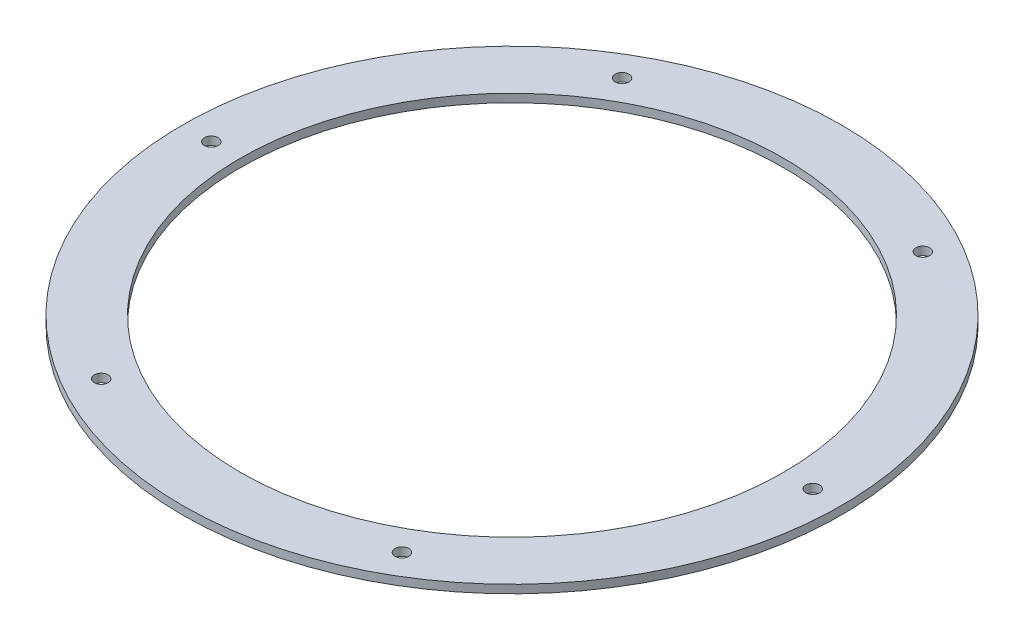
ISO-10303-21;
HEADER;
FILE_DESCRIPTION(('STEP AP214'),'2;1');
FILE_NAME('part.step','',(''),(''),'','','');
FILE_SCHEMA(('AUTOMOTIVE_DESIGN { 1 0 10303 214 1 1 1 1 }'));
ENDSEC;
DATA;
#1=APPLICATION_CONTEXT('core data for automotive mechanical design processes');
#2=APPLICATION_PROTOCOL_DEFINITION('international standard','automotive_design',2000,#1);
#3=PRODUCT_CONTEXT('',#1,'mechanical');
#4=PRODUCT('Part','Part','',(#3));
#5=PRODUCT_RELATED_PRODUCT_CATEGORY('part','',(#4));
#6=PRODUCT_DEFINITION_FORMATION('','',#4);
#7=PRODUCT_DEFINITION_CONTEXT('part definition',#1,'design');
#8=PRODUCT_DEFINITION('design','',#6,#7);
#9=PRODUCT_DEFINITION_SHAPE('','',#8);
#10=(LENGTH_UNIT() NAMED_UNIT(*) SI_UNIT(.MILLI.,.METRE.));
#11=(NAMED_UNIT(*) PLANE_ANGLE_UNIT() SI_UNIT($,.RADIAN.));
#12=(NAMED_UNIT(*) SI_UNIT($,.STERADIAN.) SOLID_ANGLE_UNIT());
#13=UNCERTAINTY_MEASURE_WITH_UNIT(LENGTH_MEASURE(1.E-05),#10,'distance_accuracy_value','');
#14=(GEOMETRIC_REPRESENTATION_CONTEXT(3) GLOBAL_UNCERTAINTY_ASSIGNED_CONTEXT((#13)) GLOBAL_UNIT_ASSIGNED_CONTEXT((#10,
#11,#12)) REPRESENTATION_CONTEXT('',''));
#15=CARTESIAN_POINT('',(0.,0.,0.));
#16=DIRECTION('',(0.,0.,1.));
#17=DIRECTION('',(1.,0.,0.));
#18=AXIS2_PLACEMENT_3D('',#15,#16,#17);
#19=CARTESIAN_POINT('',(0.,3.,0.));
#20=DIRECTION('',(0.,1.,0.));
#21=DIRECTION('',(0.,0.,1.));
#22=AXIS2_PLACEMENT_3D('',#19,#20,#21);
#23=PLANE('',#22);
#24=CARTESIAN_POINT('',(54.7499999999991,3.,94.8297817143965));
#25=DIRECTION('',(0.,1.,0.));
#26=DIRECTION('',(0.,0.,1.));
#27=AXIS2_PLACEMENT_3D('',#24,#25,#26);
#28=CIRCLE('',#27,2.49999999999999);
#29=CARTESIAN_POINT('',(54.7499999999991,3.,97.3297817143965));
#30=VERTEX_POINT('',#29);
#31=EDGE_CURVE('E71',#30,#30,#28,.T.);
#32=ORIENTED_EDGE('',*,*,#31,.F.);
#33=EDGE_LOOP('',(#32));
#34=FACE_BOUND('',#33,.T.);
#35=CARTESIAN_POINT('',(54.7500000000004,3.,-94.8297817143958));
#36=DIRECTION('',(0.,1.,0.));
#37=DIRECTION('',(0.,0.,1.));
#38=AXIS2_PLACEMENT_3D('',#35,#36,#37);
#39=CIRCLE('',#38,2.5);
#40=CARTESIAN_POINT('',(54.7500000000004,3.,-92.3297817143958));
#41=VERTEX_POINT('',#40);
#42=EDGE_CURVE('E59',#41,#41,#39,.T.);
#43=ORIENTED_EDGE('',*,*,#42,.F.);
#44=EDGE_LOOP('',(#43));
#45=FACE_BOUND('',#44,.T.);
#46=CARTESIAN_POINT('',(-109.5,3.,0.));
#47=DIRECTION('',(0.,1.,0.));
#48=DIRECTION('',(0.,0.,1.));
#49=AXIS2_PLACEMENT_3D('',#46,#47,#48);
#50=CIRCLE('',#49,2.5);
#51=CARTESIAN_POINT('',(-109.5,3.,2.5));
#52=VERTEX_POINT('',#51);
#53=EDGE_CURVE('E47',#52,#52,#50,.T.);
#54=ORIENTED_EDGE('',*,*,#53,.F.);
#55=EDGE_LOOP('',(#54));
#56=FACE_BOUND('',#55,.T.);
#57=CARTESIAN_POINT('',(0.,3.,0.));
#58=DIRECTION('',(0.,1.,0.));
#59=DIRECTION('',(0.,0.,1.));
#60=AXIS2_PLACEMENT_3D('',#57,#58,#59);
#61=CIRCLE('',#60,120.);
#62=CARTESIAN_POINT('',(0.,3.,120.));
#63=VERTEX_POINT('',#62);
#64=EDGE_CURVE('E10',#63,#63,#61,.T.);
#65=ORIENTED_EDGE('',*,*,#64,.T.);
#66=EDGE_LOOP('',(#65));
#67=FACE_BOUND('',#66,.T.);
#68=CARTESIAN_POINT('',(0.,3.,0.));
#69=DIRECTION('',(0.,1.,0.));
#70=DIRECTION('',(0.,0.,1.));
#71=AXIS2_PLACEMENT_3D('',#68,#69,#70);
#72=CIRCLE('',#71,99.);
#73=CARTESIAN_POINT('',(0.,3.,99.));
#74=VERTEX_POINT('',#73);
#75=EDGE_CURVE('E42',#74,#74,#72,.T.);
#76=ORIENTED_EDGE('',*,*,#75,.F.);
#77=EDGE_LOOP('',(#76));
#78=FACE_BOUND('',#77,.T.);
#79=CARTESIAN_POINT('',(-54.7499999999998,3.,-94.8297817143961));
#80=DIRECTION('',(0.,1.,0.));
#81=DIRECTION('',(0.,0.,1.));
#82=AXIS2_PLACEMENT_3D('',#79,#80,#81);
#83=CIRCLE('',#82,2.49999999999999);
#84=CARTESIAN_POINT('',(-54.7499999999998,3.,-92.3297817143962));
#85=VERTEX_POINT('',#84);
#86=EDGE_CURVE('E53',#85,#85,#83,.T.);
#87=ORIENTED_EDGE('',*,*,#86,.F.);
#88=EDGE_LOOP('',(#87));
#89=FACE_BOUND('',#88,.T.);
#90=CARTESIAN_POINT('',(109.5,3.,7.64634413206646E-13));
#91=DIRECTION('',(0.,1.,0.));
#92=DIRECTION('',(0.,0.,1.));
#93=AXIS2_PLACEMENT_3D('',#90,#91,#92);
#94=CIRCLE('',#93,2.49999999999999);
#95=CARTESIAN_POINT('',(109.5,3.,2.50000000000075));
#96=VERTEX_POINT('',#95);
#97=EDGE_CURVE('E65',#96,#96,#94,.T.);
#98=ORIENTED_EDGE('',*,*,#97,.F.);
#99=EDGE_LOOP('',(#98));
#100=FACE_BOUND('',#99,.T.);
#101=CARTESIAN_POINT('',(-54.7500000000011,3.,94.8297817143954));
#102=DIRECTION('',(0.,1.,0.));
#103=DIRECTION('',(0.,0.,1.));
#104=AXIS2_PLACEMENT_3D('',#101,#102,#103);
#105=CIRCLE('',#104,2.49999999999999);
#106=CARTESIAN_POINT('',(-54.7500000000011,3.,97.3297817143954));
#107=VERTEX_POINT('',#106);
#108=EDGE_CURVE('E77',#107,#107,#105,.T.);
#109=ORIENTED_EDGE('',*,*,#108,.F.);
#110=EDGE_LOOP('',(#109));
#111=FACE_BOUND('',#110,.T.);
#112=ADVANCED_FACE('F31',(#34,#45,#56,#67,#78,#89,#100,#111),#23,.T.);
#113=CARTESIAN_POINT('',(0.,0.,0.));
#114=DIRECTION('',(0.,1.,0.));
#115=DIRECTION('',(0.,0.,1.));
#116=AXIS2_PLACEMENT_3D('',#113,#114,#115);
#117=PLANE('',#116);
#118=CARTESIAN_POINT('',(0.,0.,0.));
#119=DIRECTION('',(0.,1.,0.));
#120=DIRECTION('',(0.,0.,1.));
#121=AXIS2_PLACEMENT_3D('',#118,#119,#120);
#122=CIRCLE('',#121,120.);
#123=CARTESIAN_POINT('',(0.,0.,120.));
#124=VERTEX_POINT('',#123);
#125=EDGE_CURVE('E35',#124,#124,#122,.T.);
#126=ORIENTED_EDGE('',*,*,#125,.F.);
#127=EDGE_LOOP('',(#126));
#128=FACE_BOUND('',#127,.T.);
#129=CARTESIAN_POINT('',(0.,0.,0.));
#130=DIRECTION('',(0.,1.,0.));
#131=DIRECTION('',(0.,0.,1.));
#132=AXIS2_PLACEMENT_3D('',#129,#130,#131);
#133=CIRCLE('',#132,99.);
#134=CARTESIAN_POINT('',(0.,0.,99.));
#135=VERTEX_POINT('',#134);
#136=EDGE_CURVE('E44',#135,#135,#133,.T.);
#137=ORIENTED_EDGE('',*,*,#136,.T.);
#138=EDGE_LOOP('',(#137));
#139=FACE_BOUND('',#138,.T.);
#140=CARTESIAN_POINT('',(-109.5,0.,0.));
#141=DIRECTION('',(0.,1.,0.));
#142=DIRECTION('',(0.,0.,1.));
#143=AXIS2_PLACEMENT_3D('',#140,#141,#142);
#144=CIRCLE('',#143,2.5);
#145=CARTESIAN_POINT('',(-109.5,0.,2.5));
#146=VERTEX_POINT('',#145);
#147=EDGE_CURVE('E50',#146,#146,#144,.T.);
#148=ORIENTED_EDGE('',*,*,#147,.T.);
#149=EDGE_LOOP('',(#148));
#150=FACE_BOUND('',#149,.T.);
#151=CARTESIAN_POINT('',(-54.7499999999998,0.,-94.8297817143961));
#152=DIRECTION('',(0.,1.,0.));
#153=DIRECTION('',(0.,0.,1.));
#154=AXIS2_PLACEMENT_3D('',#151,#152,#153);
#155=CIRCLE('',#154,2.49999999999999);
#156=CARTESIAN_POINT('',(-54.7499999999998,0.,-92.3297817143962));
#157=VERTEX_POINT('',#156);
#158=EDGE_CURVE('E56',#157,#157,#155,.T.);
#159=ORIENTED_EDGE('',*,*,#158,.T.);
#160=EDGE_LOOP('',(#159));
#161=FACE_BOUND('',#160,.T.);
#162=CARTESIAN_POINT('',(54.7500000000004,0.,-94.8297817143958));
#163=DIRECTION('',(0.,1.,0.));
#164=DIRECTION('',(0.,0.,1.));
#165=AXIS2_PLACEMENT_3D('',#162,#163,#164);
#166=CIRCLE('',#165,2.5);
#167=CARTESIAN_POINT('',(54.7500000000004,0.,-92.3297817143958));
#168=VERTEX_POINT('',#167);
#169=EDGE_CURVE('E62',#168,#168,#166,.T.);
#170=ORIENTED_EDGE('',*,*,#169,.T.);
#171=EDGE_LOOP('',(#170));
#172=FACE_BOUND('',#171,.T.);
#173=CARTESIAN_POINT('',(109.5,0.,7.64634413206646E-13));
#174=DIRECTION('',(0.,1.,0.));
#175=DIRECTION('',(0.,0.,1.));
#176=AXIS2_PLACEMENT_3D('',#173,#174,#175);
#177=CIRCLE('',#176,2.49999999999999);
#178=CARTESIAN_POINT('',(109.5,0.,2.50000000000075));
#179=VERTEX_POINT('',#178);
#180=EDGE_CURVE('E68',#179,#179,#177,.T.);
#181=ORIENTED_EDGE('',*,*,#180,.T.);
#182=EDGE_LOOP('',(#181));
#183=FACE_BOUND('',#182,.T.);
#184=CARTESIAN_POINT('',(54.7499999999991,0.,94.8297817143965));
#185=DIRECTION('',(0.,1.,0.));
#186=DIRECTION('',(0.,0.,1.));
#187=AXIS2_PLACEMENT_3D('',#184,#185,#186);
#188=CIRCLE('',#187,2.49999999999999);
#189=CARTESIAN_POINT('',(54.7499999999991,0.,97.3297817143965));
#190=VERTEX_POINT('',#189);
#191=EDGE_CURVE('E74',#190,#190,#188,.T.);
#192=ORIENTED_EDGE('',*,*,#191,.T.);
#193=EDGE_LOOP('',(#192));
#194=FACE_BOUND('',#193,.T.);
#195=CARTESIAN_POINT('',(-54.7500000000011,0.,94.8297817143954));
#196=DIRECTION('',(0.,1.,0.));
#197=DIRECTION('',(0.,0.,1.));
#198=AXIS2_PLACEMENT_3D('',#195,#196,#197);
#199=CIRCLE('',#198,2.49999999999999);
#200=CARTESIAN_POINT('',(-54.7500000000011,0.,97.3297817143954));
#201=VERTEX_POINT('',#200);
#202=EDGE_CURVE('E80',#201,#201,#199,.T.);
#203=ORIENTED_EDGE('',*,*,#202,.T.);
#204=EDGE_LOOP('',(#203));
#205=FACE_BOUND('',#204,.T.);
#206=ADVANCED_FACE('F90',(#128,#139,#150,#161,#172,#183,#194,#205),#117,.F.);
#207=CARTESIAN_POINT('',(0.,3.,0.));
#208=DIRECTION('',(0.,-1.,0.));
#209=DIRECTION('',(0.,0.,-1.));
#210=AXIS2_PLACEMENT_3D('',#207,#208,#209);
#211=CYLINDRICAL_SURFACE('',#210,120.);
#212=ORIENTED_EDGE('',*,*,#64,.F.);
#213=EDGE_LOOP('',(#212));
#214=FACE_BOUND('',#213,.T.);
#215=ORIENTED_EDGE('',*,*,#125,.T.);
#216=EDGE_LOOP('',(#215));
#217=FACE_BOUND('',#216,.T.);
#218=ADVANCED_FACE('F33',(#214,#217),#211,.T.);
#219=CARTESIAN_POINT('',(0.,3.,0.));
#220=DIRECTION('',(0.,-1.,0.));
#221=DIRECTION('',(0.,0.,-1.));
#222=AXIS2_PLACEMENT_3D('',#219,#220,#221);
#223=CYLINDRICAL_SURFACE('',#222,99.);
#224=ORIENTED_EDGE('',*,*,#75,.T.);
#225=EDGE_LOOP('',(#224));
#226=FACE_BOUND('',#225,.T.);
#227=ORIENTED_EDGE('',*,*,#136,.F.);
#228=EDGE_LOOP('',(#227));
#229=FACE_BOUND('',#228,.T.);
#230=ADVANCED_FACE('F100',(#226,#229),#223,.F.);
#231=CARTESIAN_POINT('',(-109.5,3.,0.));
#232=DIRECTION('',(0.,-1.,0.));
#233=DIRECTION('',(0.,0.,-1.));
#234=AXIS2_PLACEMENT_3D('',#231,#232,#233);
#235=CYLINDRICAL_SURFACE('',#234,2.5);
#236=ORIENTED_EDGE('',*,*,#53,.T.);
#237=EDGE_LOOP('',(#236));
#238=FACE_BOUND('',#237,.T.);
#239=ORIENTED_EDGE('',*,*,#147,.F.);
#240=EDGE_LOOP('',(#239));
#241=FACE_BOUND('',#240,.T.);
#242=ADVANCED_FACE('F103',(#238,#241),#235,.F.);
#243=CARTESIAN_POINT('',(-54.7499999999998,3.,-94.8297817143961));
#244=DIRECTION('',(0.,-1.,0.));
#245=DIRECTION('',(0.,0.,-1.));
#246=AXIS2_PLACEMENT_3D('',#243,#244,#245);
#247=CYLINDRICAL_SURFACE('',#246,2.49999999999999);
#248=ORIENTED_EDGE('',*,*,#86,.T.);
#249=EDGE_LOOP('',(#248));
#250=FACE_BOUND('',#249,.T.);
#251=ORIENTED_EDGE('',*,*,#158,.F.);
#252=EDGE_LOOP('',(#251));
#253=FACE_BOUND('',#252,.T.);
#254=ADVANCED_FACE('F107',(#250,#253),#247,.F.);
#255=CARTESIAN_POINT('',(54.7500000000004,3.,-94.8297817143958));
#256=DIRECTION('',(0.,-1.,0.));
#257=DIRECTION('',(0.,0.,-1.));
#258=AXIS2_PLACEMENT_3D('',#255,#256,#257);
#259=CYLINDRICAL_SURFACE('',#258,2.5);
#260=ORIENTED_EDGE('',*,*,#42,.T.);
#261=EDGE_LOOP('',(#260));
#262=FACE_BOUND('',#261,.T.);
#263=ORIENTED_EDGE('',*,*,#169,.F.);
#264=EDGE_LOOP('',(#263));
#265=FACE_BOUND('',#264,.T.);
#266=ADVANCED_FACE('F111',(#262,#265),#259,.F.);
#267=CARTESIAN_POINT('',(109.5,3.,7.64634413206646E-13));
#268=DIRECTION('',(0.,-1.,0.));
#269=DIRECTION('',(0.,0.,-1.));
#270=AXIS2_PLACEMENT_3D('',#267,#268,#269);
#271=CYLINDRICAL_SURFACE('',#270,2.49999999999999);
#272=ORIENTED_EDGE('',*,*,#97,.T.);
#273=EDGE_LOOP('',(#272));
#274=FACE_BOUND('',#273,.T.);
#275=ORIENTED_EDGE('',*,*,#180,.F.);
#276=EDGE_LOOP('',(#275));
#277=FACE_BOUND('',#276,.T.);
#278=ADVANCED_FACE('F115',(#274,#277),#271,.F.);
#279=CARTESIAN_POINT('',(54.7499999999991,3.,94.8297817143965));
#280=DIRECTION('',(0.,-1.,0.));
#281=DIRECTION('',(0.,0.,-1.));
#282=AXIS2_PLACEMENT_3D('',#279,#280,#281);
#283=CYLINDRICAL_SURFACE('',#282,2.49999999999999);
#284=ORIENTED_EDGE('',*,*,#31,.T.);
#285=EDGE_LOOP('',(#284));
#286=FACE_BOUND('',#285,.T.);
#287=ORIENTED_EDGE('',*,*,#191,.F.);
#288=EDGE_LOOP('',(#287));
#289=FACE_BOUND('',#288,.T.);
#290=ADVANCED_FACE('F119',(#286,#289),#283,.F.);
#291=CARTESIAN_POINT('',(-54.7500000000011,3.,94.8297817143954));
#292=DIRECTION('',(0.,-1.,0.));
#293=DIRECTION('',(0.,0.,-1.));
#294=AXIS2_PLACEMENT_3D('',#291,#292,#293);
#295=CYLINDRICAL_SURFACE('',#294,2.49999999999999);
#296=ORIENTED_EDGE('',*,*,#108,.T.);
#297=EDGE_LOOP('',(#296));
#298=FACE_BOUND('',#297,.T.);
#299=ORIENTED_EDGE('',*,*,#202,.F.);
#300=EDGE_LOOP('',(#299));
#301=FACE_BOUND('',#300,.T.);
#302=ADVANCED_FACE('F86',(#298,#301),#295,.F.);
#303=CLOSED_SHELL('',(#112,#206,#218,#230,#242,#254,#266,#278,#290,#302));
#304=MANIFOLD_SOLID_BREP('B2',#303);
#305=ADVANCED_BREP_SHAPE_REPRESENTATION('',(#18,#304),#14);
#306=SHAPE_DEFINITION_REPRESENTATION(#9,#305);
ENDSEC;
END-ISO-10303-21;
